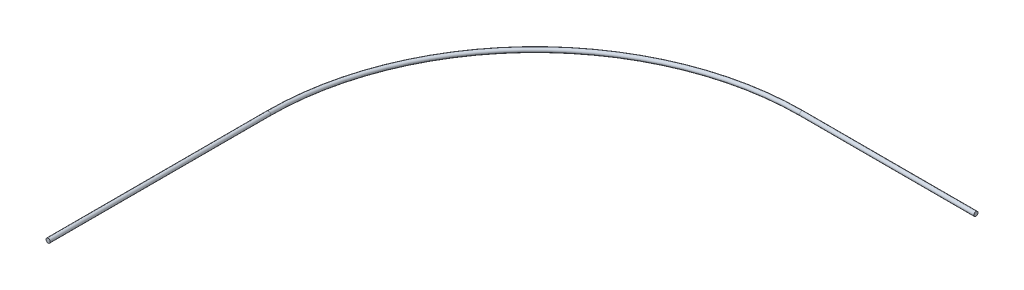
ISO-10303-21;
HEADER;
FILE_DESCRIPTION(('STEP AP214'),'2;1');
FILE_NAME('part.step','',(''),(''),'','','');
FILE_SCHEMA(('AUTOMOTIVE_DESIGN { 1 0 10303 214 1 1 1 1 }'));
ENDSEC;
DATA;
#1=APPLICATION_CONTEXT('core data for automotive mechanical design processes');
#2=APPLICATION_PROTOCOL_DEFINITION('international standard','automotive_design',2000,#1);
#3=PRODUCT_CONTEXT('',#1,'mechanical');
#4=PRODUCT('Part','Part','',(#3));
#5=PRODUCT_RELATED_PRODUCT_CATEGORY('part','',(#4));
#6=PRODUCT_DEFINITION_FORMATION('','',#4);
#7=PRODUCT_DEFINITION_CONTEXT('part definition',#1,'design');
#8=PRODUCT_DEFINITION('design','',#6,#7);
#9=PRODUCT_DEFINITION_SHAPE('','',#8);
#10=(LENGTH_UNIT() NAMED_UNIT(*) SI_UNIT(.MILLI.,.METRE.));
#11=(NAMED_UNIT(*) PLANE_ANGLE_UNIT() SI_UNIT($,.RADIAN.));
#12=(NAMED_UNIT(*) SI_UNIT($,.STERADIAN.) SOLID_ANGLE_UNIT());
#13=UNCERTAINTY_MEASURE_WITH_UNIT(LENGTH_MEASURE(1.E-05),#10,'distance_accuracy_value','');
#14=(GEOMETRIC_REPRESENTATION_CONTEXT(3) GLOBAL_UNCERTAINTY_ASSIGNED_CONTEXT((#13)) GLOBAL_UNIT_ASSIGNED_CONTEXT((#10,
#11,#12)) REPRESENTATION_CONTEXT('',''));
#15=CARTESIAN_POINT('',(0.,0.,0.));
#16=DIRECTION('',(0.,0.,1.));
#17=DIRECTION('',(1.,0.,0.));
#18=AXIS2_PLACEMENT_3D('',#15,#16,#17);
#19=CARTESIAN_POINT('',(0.,0.,0.));
#20=DIRECTION('',(0.,0.,1.));
#21=DIRECTION('',(1.,0.,0.));
#22=AXIS2_PLACEMENT_3D('',#19,#20,#21);
#23=PLANE('',#22);
#24=CARTESIAN_POINT('',(0.,0.,0.));
#25=DIRECTION('',(0.,0.,1.));
#26=DIRECTION('',(1.,0.,0.));
#27=AXIS2_PLACEMENT_3D('',#24,#25,#26);
#28=CIRCLE('',#27,0.02);
#29=CARTESIAN_POINT('',(0.02,0.,0.));
#30=VERTEX_POINT('',#29);
#31=EDGE_CURVE('E57',#30,#30,#28,.T.);
#32=ORIENTED_EDGE('',*,*,#31,.T.);
#33=EDGE_LOOP('',(#32));
#34=FACE_BOUND('',#33,.T.);
#35=ADVANCED_FACE('F40',(#34),#23,.T.);
#36=CARTESIAN_POINT('',(4.2,0.,-4.64));
#37=DIRECTION('',(-1.,0.,0.));
#38=DIRECTION('',(0.,0.,1.));
#39=AXIS2_PLACEMENT_3D('',#36,#37,#38);
#40=PLANE('',#39);
#41=CARTESIAN_POINT('',(4.2,0.,-4.64));
#42=DIRECTION('',(-1.,0.,0.));
#43=DIRECTION('',(0.,0.,1.));
#44=AXIS2_PLACEMENT_3D('',#41,#42,#43);
#45=CIRCLE('',#44,0.02);
#46=CARTESIAN_POINT('',(4.2,0.,-4.62));
#47=VERTEX_POINT('',#46);
#48=EDGE_CURVE('E10',#47,#47,#45,.T.);
#49=ORIENTED_EDGE('',*,*,#48,.F.);
#50=EDGE_LOOP('',(#49));
#51=FACE_BOUND('',#50,.T.);
#52=ADVANCED_FACE('F68',(#51),#40,.F.);
#53=CARTESIAN_POINT('',(0.,0.,0.));
#54=DIRECTION('',(0.,0.,-1.));
#55=DIRECTION('',(-1.,0.,0.));
#56=AXIS2_PLACEMENT_3D('',#53,#54,#55);
#57=CYLINDRICAL_SURFACE('',#56,0.02);
#58=CARTESIAN_POINT('',(0.,0.,-2.1));
#59=DIRECTION('',(0.,0.,1.));
#60=DIRECTION('',(1.,0.,0.));
#61=AXIS2_PLACEMENT_3D('',#58,#59,#60);
#62=CIRCLE('',#61,0.02);
#63=CARTESIAN_POINT('',(-0.0199999999999996,0.,-2.1));
#64=VERTEX_POINT('',#63);
#65=EDGE_CURVE('E52',#64,#64,#62,.T.);
#66=ORIENTED_EDGE('',*,*,#65,.T.);
#67=EDGE_LOOP('',(#66));
#68=FACE_BOUND('',#67,.T.);
#69=ORIENTED_EDGE('',*,*,#31,.F.);
#70=EDGE_LOOP('',(#69));
#71=FACE_BOUND('',#70,.T.);
#72=ADVANCED_FACE('F65',(#68,#71),#57,.T.);
#73=CARTESIAN_POINT('',(2.54,0.,-2.1));
#74=DIRECTION('',(0.,-1.,0.));
#75=DIRECTION('',(0.,0.,-1.));
#76=AXIS2_PLACEMENT_3D('',#73,#74,#75);
#77=TOROIDAL_SURFACE('',#76,2.54,0.02);
#78=CARTESIAN_POINT('',(2.54,0.,-4.64));
#79=DIRECTION('',(-1.,0.,0.));
#80=DIRECTION('',(0.,0.,1.));
#81=AXIS2_PLACEMENT_3D('',#78,#79,#80);
#82=CIRCLE('',#81,0.02);
#83=CARTESIAN_POINT('',(2.54,0.,-4.66));
#84=VERTEX_POINT('',#83);
#85=EDGE_CURVE('E47',#84,#84,#82,.T.);
#86=CARTESIAN_POINT('',(2.54,0.,-2.1));
#87=DIRECTION('',(0.,-1.,0.));
#88=DIRECTION('',(0.,0.,-1.));
#89=AXIS2_PLACEMENT_3D('',#86,#87,#88);
#90=CIRCLE('',#89,2.56);
#91=EDGE_CURVE('',#64,#84,#90,.T.);
#92=ORIENTED_EDGE('',*,*,#65,.F.);
#93=ORIENTED_EDGE('',*,*,#85,.T.);
#94=ORIENTED_EDGE('',*,*,#91,.T.);
#95=ORIENTED_EDGE('',*,*,#91,.F.);
#96=EDGE_LOOP('',(#92,#94,#93,#95));
#97=FACE_BOUND('',#96,.T.);
#98=ADVANCED_FACE('F67',(#97),#77,.T.);
#99=CARTESIAN_POINT('',(2.54,0.,-4.64));
#100=DIRECTION('',(1.,0.,0.));
#101=DIRECTION('',(0.,0.,-1.));
#102=AXIS2_PLACEMENT_3D('',#99,#100,#101);
#103=CYLINDRICAL_SURFACE('',#102,0.02);
#104=ORIENTED_EDGE('',*,*,#48,.T.);
#105=EDGE_LOOP('',(#104));
#106=FACE_BOUND('',#105,.T.);
#107=ORIENTED_EDGE('',*,*,#85,.F.);
#108=EDGE_LOOP('',(#107));
#109=FACE_BOUND('',#108,.T.);
#110=ADVANCED_FACE('F75',(#106,#109),#103,.T.);
#111=CLOSED_SHELL('',(#35,#52,#72,#98,#110));
#112=MANIFOLD_SOLID_BREP('B2',#111);
#113=ADVANCED_BREP_SHAPE_REPRESENTATION('',(#18,#112),#14);
#114=SHAPE_DEFINITION_REPRESENTATION(#9,#113);
ENDSEC;
END-ISO-10303-21;
